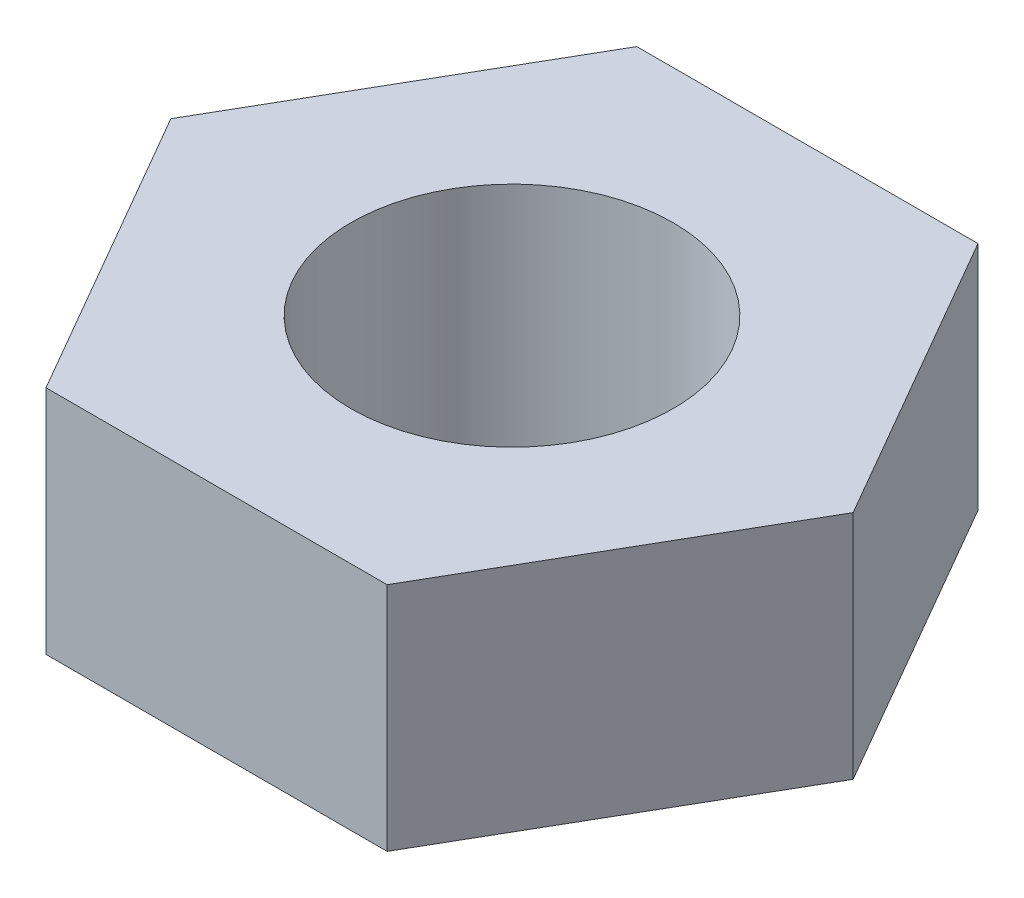
ISO-10303-21;
HEADER;
FILE_DESCRIPTION(('STEP AP214'),'2;1');
FILE_NAME('part.step','',(''),(''),'','','');
FILE_SCHEMA(('AUTOMOTIVE_DESIGN { 1 0 10303 214 1 1 1 1 }'));
ENDSEC;
DATA;
#1=APPLICATION_CONTEXT('core data for automotive mechanical design processes');
#2=APPLICATION_PROTOCOL_DEFINITION('international standard','automotive_design',2000,#1);
#3=PRODUCT_CONTEXT('',#1,'mechanical');
#4=PRODUCT('Part','Part','',(#3));
#5=PRODUCT_RELATED_PRODUCT_CATEGORY('part','',(#4));
#6=PRODUCT_DEFINITION_FORMATION('','',#4);
#7=PRODUCT_DEFINITION_CONTEXT('part definition',#1,'design');
#8=PRODUCT_DEFINITION('design','',#6,#7);
#9=PRODUCT_DEFINITION_SHAPE('','',#8);
#10=(LENGTH_UNIT() NAMED_UNIT(*) SI_UNIT(.MILLI.,.METRE.));
#11=(NAMED_UNIT(*) PLANE_ANGLE_UNIT() SI_UNIT($,.RADIAN.));
#12=(NAMED_UNIT(*) SI_UNIT($,.STERADIAN.) SOLID_ANGLE_UNIT());
#13=UNCERTAINTY_MEASURE_WITH_UNIT(LENGTH_MEASURE(1.E-05),#10,'distance_accuracy_value','');
#14=(GEOMETRIC_REPRESENTATION_CONTEXT(3) GLOBAL_UNCERTAINTY_ASSIGNED_CONTEXT((#13)) GLOBAL_UNIT_ASSIGNED_CONTEXT((#10,
#11,#12)) REPRESENTATION_CONTEXT('',''));
#15=CARTESIAN_POINT('',(0.,0.,0.));
#16=DIRECTION('',(0.,0.,1.));
#17=DIRECTION('',(1.,0.,0.));
#18=AXIS2_PLACEMENT_3D('',#15,#16,#17);
#19=CARTESIAN_POINT('',(1.58771324027146,2.15,2.74999999999999));
#20=DIRECTION('',(-0.866025403784438,0.,-0.5));
#21=DIRECTION('',(-0.5,0.,0.866025403784438));
#22=AXIS2_PLACEMENT_3D('',#19,#20,#21);
#23=PLANE('',#22);
#24=DIRECTION('',(0.5,0.,-0.866025403784438));
#25=VECTOR('',#24,1.);
#26=CARTESIAN_POINT('',(1.58771324027146,0.,2.74999999999999));
#27=LINE('',#26,#25);
#28=CARTESIAN_POINT('',(1.58771324027146,0.,2.74999999999999));
#29=VERTEX_POINT('',#28);
#30=CARTESIAN_POINT('',(3.17542648054293,0.,0.));
#31=VERTEX_POINT('',#30);
#32=EDGE_CURVE('E123',#29,#31,#27,.T.);
#33=ORIENTED_EDGE('',*,*,#32,.T.);
#34=DIRECTION('',(0.,-1.,0.));
#35=VECTOR('',#34,1.);
#36=CARTESIAN_POINT('',(3.17542648054293,2.15,0.));
#37=LINE('',#36,#35);
#38=CARTESIAN_POINT('',(3.17542648054293,2.15,0.));
#39=VERTEX_POINT('',#38);
#40=EDGE_CURVE('E11',#39,#31,#37,.T.);
#41=ORIENTED_EDGE('',*,*,#40,.F.);
#42=DIRECTION('',(0.5,0.,-0.866025403784438));
#43=VECTOR('',#42,1.);
#44=CARTESIAN_POINT('',(1.58771324027146,2.15,2.74999999999999));
#45=LINE('',#44,#43);
#46=CARTESIAN_POINT('',(1.58771324027146,2.15,2.74999999999999));
#47=VERTEX_POINT('',#46);
#48=EDGE_CURVE('E134',#47,#39,#45,.T.);
#49=ORIENTED_EDGE('',*,*,#48,.F.);
#50=DIRECTION('',(0.,-1.,0.));
#51=VECTOR('',#50,1.);
#52=CARTESIAN_POINT('',(1.58771324027146,2.15,2.74999999999999));
#53=LINE('',#52,#51);
#54=EDGE_CURVE('E119',#47,#29,#53,.T.);
#55=ORIENTED_EDGE('',*,*,#54,.T.);
#56=EDGE_LOOP('',(#33,#41,#49,#55));
#57=FACE_BOUND('',#56,.T.);
#58=ADVANCED_FACE('F38',(#57),#23,.F.);
#59=CARTESIAN_POINT('',(3.17542648054293,2.15,0.));
#60=DIRECTION('',(-0.866025403784438,0.,0.5));
#61=DIRECTION('',(0.5,0.,0.866025403784439));
#62=AXIS2_PLACEMENT_3D('',#59,#60,#61);
#63=PLANE('',#62);
#64=DIRECTION('',(-0.5,0.,-0.866025403784438));
#65=VECTOR('',#64,1.);
#66=CARTESIAN_POINT('',(3.17542648054293,0.,0.));
#67=LINE('',#66,#65);
#68=CARTESIAN_POINT('',(1.58771324027145,0.,-2.75000000000001));
#69=VERTEX_POINT('',#68);
#70=EDGE_CURVE('E126',#31,#69,#67,.T.);
#71=ORIENTED_EDGE('',*,*,#70,.T.);
#72=DIRECTION('',(0.,-1.,0.));
#73=VECTOR('',#72,1.);
#74=CARTESIAN_POINT('',(1.58771324027145,2.15,-2.75000000000001));
#75=LINE('',#74,#73);
#76=CARTESIAN_POINT('',(1.58771324027145,2.15,-2.75000000000001));
#77=VERTEX_POINT('',#76);
#78=EDGE_CURVE('E47',#77,#69,#75,.T.);
#79=ORIENTED_EDGE('',*,*,#78,.F.);
#80=DIRECTION('',(-0.5,0.,-0.866025403784438));
#81=VECTOR('',#80,1.);
#82=CARTESIAN_POINT('',(3.17542648054293,2.15,0.));
#83=LINE('',#82,#81);
#84=EDGE_CURVE('E92',#39,#77,#83,.T.);
#85=ORIENTED_EDGE('',*,*,#84,.F.);
#86=ORIENTED_EDGE('',*,*,#40,.T.);
#87=EDGE_LOOP('',(#71,#79,#85,#86));
#88=FACE_BOUND('',#87,.T.);
#89=ADVANCED_FACE('F160',(#88),#63,.F.);
#90=CARTESIAN_POINT('',(1.58771324027145,2.15,-2.75000000000001));
#91=DIRECTION('',(0.,0.,1.));
#92=DIRECTION('',(1.,0.,0.));
#93=AXIS2_PLACEMENT_3D('',#90,#91,#92);
#94=PLANE('',#93);
#95=DIRECTION('',(-1.,0.,0.));
#96=VECTOR('',#95,1.);
#97=CARTESIAN_POINT('',(1.58771324027145,0.,-2.75000000000001));
#98=LINE('',#97,#96);
#99=CARTESIAN_POINT('',(-1.58771324027146,0.,-2.75));
#100=VERTEX_POINT('',#99);
#101=EDGE_CURVE('E129',#69,#100,#98,.T.);
#102=ORIENTED_EDGE('',*,*,#101,.T.);
#103=DIRECTION('',(0.,-1.,0.));
#104=VECTOR('',#103,1.);
#105=CARTESIAN_POINT('',(-1.58771324027146,2.15,-2.75));
#106=LINE('',#105,#104);
#107=CARTESIAN_POINT('',(-1.58771324027146,2.15,-2.75));
#108=VERTEX_POINT('',#107);
#109=EDGE_CURVE('E114',#108,#100,#106,.T.);
#110=ORIENTED_EDGE('',*,*,#109,.F.);
#111=DIRECTION('',(-1.,0.,0.));
#112=VECTOR('',#111,1.);
#113=CARTESIAN_POINT('',(1.58771324027145,2.15,-2.75000000000001));
#114=LINE('',#113,#112);
#115=EDGE_CURVE('E105',#77,#108,#114,.T.);
#116=ORIENTED_EDGE('',*,*,#115,.F.);
#117=ORIENTED_EDGE('',*,*,#78,.T.);
#118=EDGE_LOOP('',(#102,#110,#116,#117));
#119=FACE_BOUND('',#118,.T.);
#120=ADVANCED_FACE('F141',(#119),#94,.F.);
#121=CARTESIAN_POINT('',(-1.58771324027146,2.15,-2.75));
#122=DIRECTION('',(0.866025403784438,0.,0.5));
#123=DIRECTION('',(0.5,0.,-0.866025403784439));
#124=AXIS2_PLACEMENT_3D('',#121,#122,#123);
#125=PLANE('',#124);
#126=DIRECTION('',(-0.5,0.,0.866025403784438));
#127=VECTOR('',#126,1.);
#128=CARTESIAN_POINT('',(-1.58771324027146,0.,-2.75));
#129=LINE('',#128,#127);
#130=CARTESIAN_POINT('',(-3.17542648054294,0.,0.));
#131=VERTEX_POINT('',#130);
#132=EDGE_CURVE('E113',#100,#131,#129,.T.);
#133=ORIENTED_EDGE('',*,*,#132,.T.);
#134=DIRECTION('',(0.,-1.,0.));
#135=VECTOR('',#134,1.);
#136=CARTESIAN_POINT('',(-3.17542648054294,2.15,0.));
#137=LINE('',#136,#135);
#138=CARTESIAN_POINT('',(-3.17542648054294,2.15,0.));
#139=VERTEX_POINT('',#138);
#140=EDGE_CURVE('E110',#139,#131,#137,.T.);
#141=ORIENTED_EDGE('',*,*,#140,.F.);
#142=DIRECTION('',(-0.5,0.,0.866025403784438));
#143=VECTOR('',#142,1.);
#144=CARTESIAN_POINT('',(-1.58771324027146,2.15,-2.75));
#145=LINE('',#144,#143);
#146=EDGE_CURVE('E99',#108,#139,#145,.T.);
#147=ORIENTED_EDGE('',*,*,#146,.F.);
#148=ORIENTED_EDGE('',*,*,#109,.T.);
#149=EDGE_LOOP('',(#133,#141,#147,#148));
#150=FACE_BOUND('',#149,.T.);
#151=ADVANCED_FACE('F111',(#150),#125,.F.);
#152=CARTESIAN_POINT('',(-3.17542648054294,2.15,0.));
#153=DIRECTION('',(0.866025403784439,0.,-0.499999999999999));
#154=DIRECTION('',(-0.499999999999999,0.,-0.866025403784439));
#155=AXIS2_PLACEMENT_3D('',#152,#153,#154);
#156=PLANE('',#155);
#157=DIRECTION('',(0.499999999999999,0.,0.866025403784439));
#158=VECTOR('',#157,1.);
#159=CARTESIAN_POINT('',(-3.17542648054294,0.,0.));
#160=LINE('',#159,#158);
#161=CARTESIAN_POINT('',(-1.58771324027147,0.,2.75));
#162=VERTEX_POINT('',#161);
#163=EDGE_CURVE('E78',#131,#162,#160,.T.);
#164=ORIENTED_EDGE('',*,*,#163,.T.);
#165=DIRECTION('',(0.,-1.,0.));
#166=VECTOR('',#165,1.);
#167=CARTESIAN_POINT('',(-1.58771324027147,2.15,2.75));
#168=LINE('',#167,#166);
#169=CARTESIAN_POINT('',(-1.58771324027147,2.15,2.75));
#170=VERTEX_POINT('',#169);
#171=EDGE_CURVE('E115',#170,#162,#168,.T.);
#172=ORIENTED_EDGE('',*,*,#171,.F.);
#173=DIRECTION('',(0.499999999999999,0.,0.866025403784439));
#174=VECTOR('',#173,1.);
#175=CARTESIAN_POINT('',(-3.17542648054294,2.15,0.));
#176=LINE('',#175,#174);
#177=EDGE_CURVE('E103',#139,#170,#176,.T.);
#178=ORIENTED_EDGE('',*,*,#177,.F.);
#179=ORIENTED_EDGE('',*,*,#140,.T.);
#180=EDGE_LOOP('',(#164,#172,#178,#179));
#181=FACE_BOUND('',#180,.T.);
#182=ADVANCED_FACE('F117',(#181),#156,.F.);
#183=CARTESIAN_POINT('',(-1.58771324027147,2.15,2.75));
#184=DIRECTION('',(0.,0.,-1.));
#185=DIRECTION('',(-1.,0.,0.));
#186=AXIS2_PLACEMENT_3D('',#183,#184,#185);
#187=PLANE('',#186);
#188=DIRECTION('',(1.,0.,0.));
#189=VECTOR('',#188,1.);
#190=CARTESIAN_POINT('',(-1.58771324027147,0.,2.75));
#191=LINE('',#190,#189);
#192=EDGE_CURVE('E84',#162,#29,#191,.T.);
#193=ORIENTED_EDGE('',*,*,#192,.T.);
#194=ORIENTED_EDGE('',*,*,#54,.F.);
#195=DIRECTION('',(1.,0.,0.));
#196=VECTOR('',#195,1.);
#197=CARTESIAN_POINT('',(-1.58771324027147,2.15,2.75));
#198=LINE('',#197,#196);
#199=EDGE_CURVE('E55',#170,#47,#198,.T.);
#200=ORIENTED_EDGE('',*,*,#199,.F.);
#201=ORIENTED_EDGE('',*,*,#171,.T.);
#202=EDGE_LOOP('',(#193,#194,#200,#201));
#203=FACE_BOUND('',#202,.T.);
#204=ADVANCED_FACE('F148',(#203),#187,.F.);
#205=CARTESIAN_POINT('',(0.,2.15,0.));
#206=DIRECTION('',(0.,1.,0.));
#207=DIRECTION('',(0.,0.,1.));
#208=AXIS2_PLACEMENT_3D('',#205,#206,#207);
#209=PLANE('',#208);
#210=CARTESIAN_POINT('',(0.,2.15,0.));
#211=DIRECTION('',(0.,1.,0.));
#212=DIRECTION('',(0.,0.,1.));
#213=AXIS2_PLACEMENT_3D('',#210,#211,#212);
#214=CIRCLE('',#213,1.5);
#215=CARTESIAN_POINT('',(0.,2.15,1.5));
#216=VERTEX_POINT('',#215);
#217=EDGE_CURVE('E127',#216,#216,#214,.F.);
#218=ORIENTED_EDGE('',*,*,#217,.T.);
#219=EDGE_LOOP('',(#218));
#220=FACE_BOUND('',#219,.T.);
#221=ORIENTED_EDGE('',*,*,#48,.T.);
#222=ORIENTED_EDGE('',*,*,#84,.T.);
#223=ORIENTED_EDGE('',*,*,#115,.T.);
#224=ORIENTED_EDGE('',*,*,#146,.T.);
#225=ORIENTED_EDGE('',*,*,#177,.T.);
#226=ORIENTED_EDGE('',*,*,#199,.T.);
#227=EDGE_LOOP('',(#221,#222,#223,#224,#225,#226));
#228=FACE_BOUND('',#227,.T.);
#229=ADVANCED_FACE('F101',(#220,#228),#209,.T.);
#230=CARTESIAN_POINT('',(0.,0.,0.));
#231=DIRECTION('',(0.,1.,0.));
#232=DIRECTION('',(0.,0.,1.));
#233=AXIS2_PLACEMENT_3D('',#230,#231,#232);
#234=PLANE('',#233);
#235=CARTESIAN_POINT('',(0.,0.,0.));
#236=DIRECTION('',(0.,1.,0.));
#237=DIRECTION('',(0.,0.,1.));
#238=AXIS2_PLACEMENT_3D('',#235,#236,#237);
#239=CIRCLE('',#238,1.5);
#240=CARTESIAN_POINT('',(0.,0.,1.5));
#241=VERTEX_POINT('',#240);
#242=EDGE_CURVE('E41',#241,#241,#239,.F.);
#243=ORIENTED_EDGE('',*,*,#242,.F.);
#244=EDGE_LOOP('',(#243));
#245=FACE_BOUND('',#244,.T.);
#246=ORIENTED_EDGE('',*,*,#32,.F.);
#247=ORIENTED_EDGE('',*,*,#192,.F.);
#248=ORIENTED_EDGE('',*,*,#163,.F.);
#249=ORIENTED_EDGE('',*,*,#132,.F.);
#250=ORIENTED_EDGE('',*,*,#101,.F.);
#251=ORIENTED_EDGE('',*,*,#70,.F.);
#252=EDGE_LOOP('',(#246,#247,#248,#249,#250,#251));
#253=FACE_BOUND('',#252,.T.);
#254=ADVANCED_FACE('F144',(#245,#253),#234,.F.);
#255=CARTESIAN_POINT('',(0.,3.,0.));
#256=DIRECTION('',(0.,-1.,0.));
#257=DIRECTION('',(0.,0.,-1.));
#258=AXIS2_PLACEMENT_3D('',#255,#256,#257);
#259=CYLINDRICAL_SURFACE('',#258,1.5);
#260=ORIENTED_EDGE('',*,*,#217,.F.);
#261=EDGE_LOOP('',(#260));
#262=FACE_BOUND('',#261,.T.);
#263=ORIENTED_EDGE('',*,*,#242,.T.);
#264=EDGE_LOOP('',(#263));
#265=FACE_BOUND('',#264,.T.);
#266=ADVANCED_FACE('F200',(#262,#265),#259,.F.);
#267=CLOSED_SHELL('',(#58,#89,#120,#151,#182,#204,#229,#254,#266));
#268=MANIFOLD_SOLID_BREP('B2',#267);
#269=ADVANCED_BREP_SHAPE_REPRESENTATION('',(#18,#268),#14);
#270=SHAPE_DEFINITION_REPRESENTATION(#9,#269);
ENDSEC;
END-ISO-10303-21;
